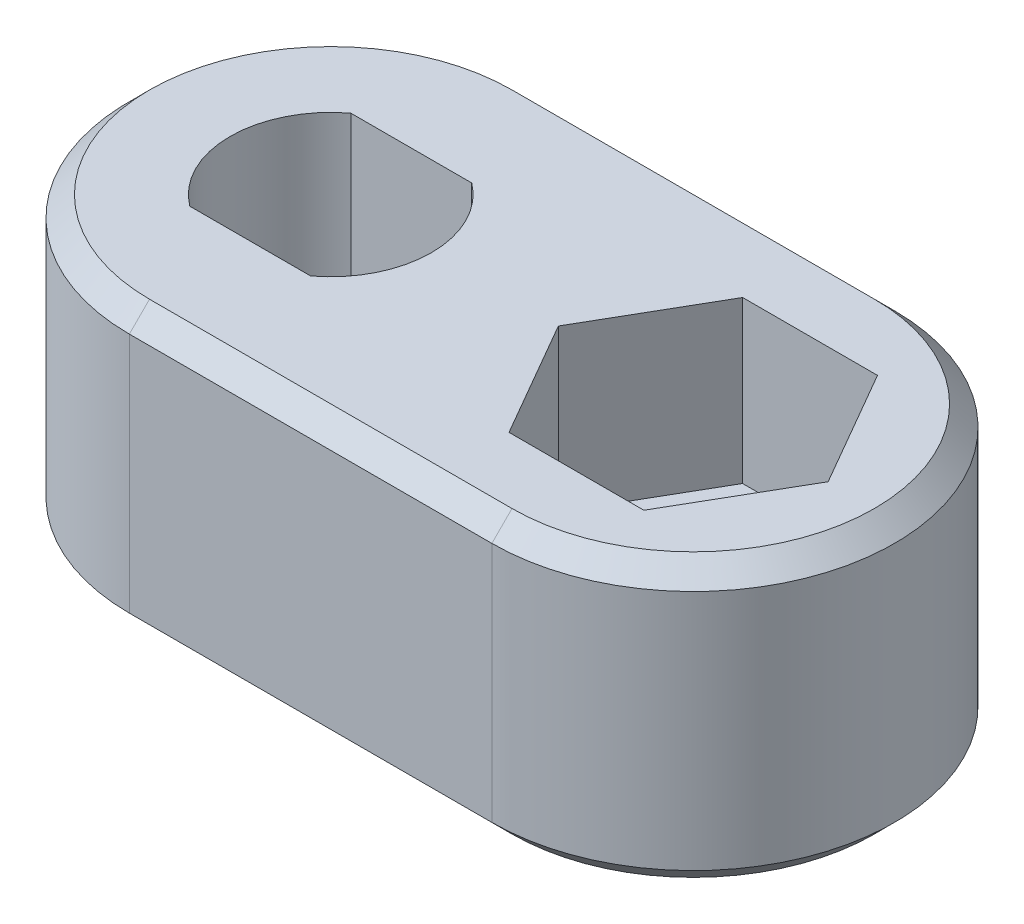
ISO-10303-21;
HEADER;
FILE_DESCRIPTION(('STEP AP214'),'2;1');
FILE_NAME('part.step','',(''),(''),'','','');
FILE_SCHEMA(('AUTOMOTIVE_DESIGN { 1 0 10303 214 1 1 1 1 }'));
ENDSEC;
DATA;
#1=APPLICATION_CONTEXT('core data for automotive mechanical design processes');
#2=APPLICATION_PROTOCOL_DEFINITION('international standard','automotive_design',2000,#1);
#3=PRODUCT_CONTEXT('',#1,'mechanical');
#4=PRODUCT('Part','Part','',(#3));
#5=PRODUCT_RELATED_PRODUCT_CATEGORY('part','',(#4));
#6=PRODUCT_DEFINITION_FORMATION('','',#4);
#7=PRODUCT_DEFINITION_CONTEXT('part definition',#1,'design');
#8=PRODUCT_DEFINITION('design','',#6,#7);
#9=PRODUCT_DEFINITION_SHAPE('','',#8);
#10=(LENGTH_UNIT() NAMED_UNIT(*) SI_UNIT(.MILLI.,.METRE.));
#11=(NAMED_UNIT(*) PLANE_ANGLE_UNIT() SI_UNIT($,.RADIAN.));
#12=(NAMED_UNIT(*) SI_UNIT($,.STERADIAN.) SOLID_ANGLE_UNIT());
#13=UNCERTAINTY_MEASURE_WITH_UNIT(LENGTH_MEASURE(1.E-05),#10,'distance_accuracy_value','');
#14=(GEOMETRIC_REPRESENTATION_CONTEXT(3) GLOBAL_UNCERTAINTY_ASSIGNED_CONTEXT((#13)) GLOBAL_UNIT_ASSIGNED_CONTEXT((#10,
#11,#12)) REPRESENTATION_CONTEXT('',''));
#15=CARTESIAN_POINT('',(0.,0.,0.));
#16=DIRECTION('',(0.,0.,1.));
#17=DIRECTION('',(1.,0.,0.));
#18=AXIS2_PLACEMENT_3D('',#15,#16,#17);
#19=CARTESIAN_POINT('',(9.,0.,0.));
#20=DIRECTION('',(0.,-1.,0.));
#21=DIRECTION('',(0.,0.,-1.));
#22=AXIS2_PLACEMENT_3D('',#19,#20,#21);
#23=CYLINDRICAL_SURFACE('',#22,2.07500000000001);
#24=CARTESIAN_POINT('',(9.,0.,0.));
#25=DIRECTION('',(0.,-1.,0.));
#26=DIRECTION('',(0.,0.,-1.));
#27=AXIS2_PLACEMENT_3D('',#24,#25,#26);
#28=CIRCLE('',#27,2.07500000000001);
#29=CARTESIAN_POINT('',(9.,0.,-2.07500000000001));
#30=VERTEX_POINT('',#29);
#31=EDGE_CURVE('E253',#30,#30,#28,.T.);
#32=ORIENTED_EDGE('',*,*,#31,.T.);
#33=EDGE_LOOP('',(#32));
#34=FACE_BOUND('',#33,.T.);
#35=CARTESIAN_POINT('',(9.,3.,0.));
#36=DIRECTION('',(0.,1.,0.));
#37=DIRECTION('',(0.,0.,1.));
#38=AXIS2_PLACEMENT_3D('',#35,#36,#37);
#39=CIRCLE('',#38,2.07500000000001);
#40=CARTESIAN_POINT('',(9.,3.,2.07500000000001));
#41=VERTEX_POINT('',#40);
#42=EDGE_CURVE('E241',#41,#41,#39,.F.);
#43=ORIENTED_EDGE('',*,*,#42,.F.);
#44=EDGE_LOOP('',(#43));
#45=FACE_BOUND('',#44,.T.);
#46=ADVANCED_FACE('F45',(#34,#45),#23,.F.);
#47=CARTESIAN_POINT('',(0.,7.,0.));
#48=DIRECTION('',(0.,-1.,0.));
#49=DIRECTION('',(0.,0.,-1.));
#50=AXIS2_PLACEMENT_3D('',#47,#48,#49);
#51=CYLINDRICAL_SURFACE('',#50,5.);
#52=DIRECTION('',(0.,-1.,0.));
#53=VECTOR('',#52,1.);
#54=CARTESIAN_POINT('',(0.,7.,5.));
#55=LINE('',#54,#53);
#56=CARTESIAN_POINT('',(0.,6.5,5.));
#57=VERTEX_POINT('',#56);
#58=CARTESIAN_POINT('',(0.,0.500000000000004,5.));
#59=VERTEX_POINT('',#58);
#60=EDGE_CURVE('E315',#57,#59,#55,.T.);
#61=ORIENTED_EDGE('',*,*,#60,.F.);
#62=CARTESIAN_POINT('',(0.,6.5,0.));
#63=DIRECTION('',(0.,1.,0.));
#64=DIRECTION('',(0.,0.,1.));
#65=AXIS2_PLACEMENT_3D('',#62,#63,#64);
#66=CIRCLE('',#65,5.);
#67=CARTESIAN_POINT('',(0.,6.5,-5.));
#68=VERTEX_POINT('',#67);
#69=EDGE_CURVE('E349',#57,#68,#66,.F.);
#70=ORIENTED_EDGE('',*,*,#69,.T.);
#71=DIRECTION('',(0.,-1.,0.));
#72=VECTOR('',#71,1.);
#73=CARTESIAN_POINT('',(0.,7.,-5.));
#74=LINE('',#73,#72);
#75=CARTESIAN_POINT('',(0.,0.500000000000004,-5.));
#76=VERTEX_POINT('',#75);
#77=EDGE_CURVE('E294',#68,#76,#74,.T.);
#78=ORIENTED_EDGE('',*,*,#77,.T.);
#79=CARTESIAN_POINT('',(0.,0.500000000000004,0.));
#80=DIRECTION('',(0.,1.,0.));
#81=DIRECTION('',(0.,0.,1.));
#82=AXIS2_PLACEMENT_3D('',#79,#80,#81);
#83=CIRCLE('',#82,5.);
#84=EDGE_CURVE('E346',#76,#59,#83,.T.);
#85=ORIENTED_EDGE('',*,*,#84,.T.);
#86=EDGE_LOOP('',(#61,#70,#78,#85));
#87=FACE_BOUND('',#86,.T.);
#88=ADVANCED_FACE('F418',(#87),#51,.T.);
#89=CARTESIAN_POINT('',(0.,7.,5.));
#90=DIRECTION('',(0.,0.,-1.));
#91=DIRECTION('',(-1.,0.,0.));
#92=AXIS2_PLACEMENT_3D('',#89,#90,#91);
#93=PLANE('',#92);
#94=DIRECTION('',(0.,-1.,0.));
#95=VECTOR('',#94,1.);
#96=CARTESIAN_POINT('',(9.,7.,5.));
#97=LINE('',#96,#95);
#98=CARTESIAN_POINT('',(9.,6.5,5.));
#99=VERTEX_POINT('',#98);
#100=CARTESIAN_POINT('',(9.,0.500000000000004,5.));
#101=VERTEX_POINT('',#100);
#102=EDGE_CURVE('E311',#99,#101,#97,.T.);
#103=ORIENTED_EDGE('',*,*,#102,.F.);
#104=DIRECTION('',(-1.,0.,0.));
#105=VECTOR('',#104,1.);
#106=CARTESIAN_POINT('',(0.,6.5,5.));
#107=LINE('',#106,#105);
#108=EDGE_CURVE('E361',#99,#57,#107,.T.);
#109=ORIENTED_EDGE('',*,*,#108,.T.);
#110=ORIENTED_EDGE('',*,*,#60,.T.);
#111=DIRECTION('',(1.,0.,0.));
#112=VECTOR('',#111,1.);
#113=CARTESIAN_POINT('',(0.,0.500000000000004,5.));
#114=LINE('',#113,#112);
#115=EDGE_CURVE('E358',#59,#101,#114,.T.);
#116=ORIENTED_EDGE('',*,*,#115,.T.);
#117=EDGE_LOOP('',(#103,#109,#110,#116));
#118=FACE_BOUND('',#117,.T.);
#119=ADVANCED_FACE('F435',(#118),#93,.F.);
#120=CARTESIAN_POINT('',(9.,7.,0.));
#121=DIRECTION('',(0.,-1.,0.));
#122=DIRECTION('',(0.,0.,-1.));
#123=AXIS2_PLACEMENT_3D('',#120,#121,#122);
#124=CYLINDRICAL_SURFACE('',#123,5.);
#125=DIRECTION('',(0.,-1.,0.));
#126=VECTOR('',#125,1.);
#127=CARTESIAN_POINT('',(9.,7.,-5.));
#128=LINE('',#127,#126);
#129=CARTESIAN_POINT('',(9.,6.5,-5.));
#130=VERTEX_POINT('',#129);
#131=CARTESIAN_POINT('',(9.,0.500000000000004,-5.));
#132=VERTEX_POINT('',#131);
#133=EDGE_CURVE('E307',#130,#132,#128,.T.);
#134=ORIENTED_EDGE('',*,*,#133,.F.);
#135=CARTESIAN_POINT('',(9.,6.5,0.));
#136=DIRECTION('',(0.,1.,0.));
#137=DIRECTION('',(0.,0.,1.));
#138=AXIS2_PLACEMENT_3D('',#135,#136,#137);
#139=CIRCLE('',#138,5.);
#140=EDGE_CURVE('E355',#130,#99,#139,.F.);
#141=ORIENTED_EDGE('',*,*,#140,.T.);
#142=ORIENTED_EDGE('',*,*,#102,.T.);
#143=CARTESIAN_POINT('',(9.,0.500000000000004,0.));
#144=DIRECTION('',(0.,1.,0.));
#145=DIRECTION('',(0.,0.,1.));
#146=AXIS2_PLACEMENT_3D('',#143,#144,#145);
#147=CIRCLE('',#146,5.);
#148=EDGE_CURVE('E352',#101,#132,#147,.T.);
#149=ORIENTED_EDGE('',*,*,#148,.T.);
#150=EDGE_LOOP('',(#134,#141,#142,#149));
#151=FACE_BOUND('',#150,.T.);
#152=ADVANCED_FACE('F431',(#151),#124,.T.);
#153=CARTESIAN_POINT('',(0.,7.,-5.));
#154=DIRECTION('',(0.,0.,1.));
#155=DIRECTION('',(1.,0.,0.));
#156=AXIS2_PLACEMENT_3D('',#153,#154,#155);
#157=PLANE('',#156);
#158=ORIENTED_EDGE('',*,*,#77,.F.);
#159=DIRECTION('',(1.,0.,0.));
#160=VECTOR('',#159,1.);
#161=CARTESIAN_POINT('',(9.,6.5,-5.));
#162=LINE('',#161,#160);
#163=EDGE_CURVE('E342',#68,#130,#162,.T.);
#164=ORIENTED_EDGE('',*,*,#163,.T.);
#165=ORIENTED_EDGE('',*,*,#133,.T.);
#166=DIRECTION('',(-1.,0.,0.));
#167=VECTOR('',#166,1.);
#168=CARTESIAN_POINT('',(0.,0.500000000000004,-5.));
#169=LINE('',#168,#167);
#170=EDGE_CURVE('E338',#132,#76,#169,.T.);
#171=ORIENTED_EDGE('',*,*,#170,.T.);
#172=EDGE_LOOP('',(#158,#164,#165,#171));
#173=FACE_BOUND('',#172,.T.);
#174=ADVANCED_FACE('F415',(#173),#157,.F.);
#175=CARTESIAN_POINT('',(0.,7.,0.));
#176=DIRECTION('',(0.,1.,0.));
#177=DIRECTION('',(0.,0.,1.));
#178=AXIS2_PLACEMENT_3D('',#175,#176,#177);
#179=PLANE('',#178);
#180=CARTESIAN_POINT('',(9.,7.,0.));
#181=DIRECTION('',(0.,1.,0.));
#182=DIRECTION('',(0.,0.,1.));
#183=AXIS2_PLACEMENT_3D('',#180,#181,#182);
#184=CIRCLE('',#183,4.5);
#185=CARTESIAN_POINT('',(9.,7.,4.5));
#186=VERTEX_POINT('',#185);
#187=CARTESIAN_POINT('',(9.,7.,-4.5));
#188=VERTEX_POINT('',#187);
#189=EDGE_CURVE('E328',#186,#188,#184,.T.);
#190=ORIENTED_EDGE('',*,*,#189,.T.);
#191=DIRECTION('',(-1.,0.,0.));
#192=VECTOR('',#191,1.);
#193=CARTESIAN_POINT('',(0.,7.,-4.5));
#194=LINE('',#193,#192);
#195=CARTESIAN_POINT('',(0.,7.,-4.5));
#196=VERTEX_POINT('',#195);
#197=EDGE_CURVE('E334',#188,#196,#194,.T.);
#198=ORIENTED_EDGE('',*,*,#197,.T.);
#199=CARTESIAN_POINT('',(0.,7.,0.));
#200=DIRECTION('',(0.,1.,0.));
#201=DIRECTION('',(0.,0.,1.));
#202=AXIS2_PLACEMENT_3D('',#199,#200,#201);
#203=CIRCLE('',#202,4.5);
#204=CARTESIAN_POINT('',(0.,7.,4.5));
#205=VERTEX_POINT('',#204);
#206=EDGE_CURVE('E331',#196,#205,#203,.T.);
#207=ORIENTED_EDGE('',*,*,#206,.T.);
#208=DIRECTION('',(1.,0.,0.));
#209=VECTOR('',#208,1.);
#210=CARTESIAN_POINT('',(9.,7.,4.5));
#211=LINE('',#210,#209);
#212=EDGE_CURVE('E319',#205,#186,#211,.T.);
#213=ORIENTED_EDGE('',*,*,#212,.T.);
#214=EDGE_LOOP('',(#190,#198,#207,#213));
#215=FACE_BOUND('',#214,.T.);
#216=DIRECTION('',(0.5,0.,-0.866025403784439));
#217=VECTOR('',#216,1.);
#218=CARTESIAN_POINT('',(10.6743157806499,7.,2.89999999999963));
#219=LINE('',#218,#217);
#220=CARTESIAN_POINT('',(10.6743157806499,7.,2.89999999999963));
#221=VERTEX_POINT('',#220);
#222=CARTESIAN_POINT('',(12.3486315612998,7.,-3.65159291693118E-13));
#223=VERTEX_POINT('',#222);
#224=EDGE_CURVE('E180',#221,#223,#219,.T.);
#225=ORIENTED_EDGE('',*,*,#224,.F.);
#226=DIRECTION('',(1.,0.,0.));
#227=VECTOR('',#226,1.);
#228=CARTESIAN_POINT('',(7.32568421935006,7.,2.89999999999963));
#229=LINE('',#228,#227);
#230=CARTESIAN_POINT('',(7.32568421935006,7.,2.89999999999963));
#231=VERTEX_POINT('',#230);
#232=EDGE_CURVE('E202',#231,#221,#229,.T.);
#233=ORIENTED_EDGE('',*,*,#232,.F.);
#234=DIRECTION('',(0.5,0.,0.866025403784439));
#235=VECTOR('',#234,1.);
#236=CARTESIAN_POINT('',(5.65136843870014,7.,-3.6457803915255E-13));
#237=LINE('',#236,#235);
#238=CARTESIAN_POINT('',(5.65136843870014,7.,-3.6457803915255E-13));
#239=VERTEX_POINT('',#238);
#240=EDGE_CURVE('E207',#239,#231,#237,.T.);
#241=ORIENTED_EDGE('',*,*,#240,.F.);
#242=DIRECTION('',(-0.5,0.,0.866025403784439));
#243=VECTOR('',#242,1.);
#244=CARTESIAN_POINT('',(7.32568421935006,7.,-2.90000000000037));
#245=LINE('',#244,#243);
#246=CARTESIAN_POINT('',(7.32568421935006,7.,-2.90000000000037));
#247=VERTEX_POINT('',#246);
#248=EDGE_CURVE('E231',#247,#239,#245,.T.);
#249=ORIENTED_EDGE('',*,*,#248,.F.);
#250=DIRECTION('',(-1.,0.,0.));
#251=VECTOR('',#250,1.);
#252=CARTESIAN_POINT('',(10.6743157806499,7.,-2.90000000000037));
#253=LINE('',#252,#251);
#254=CARTESIAN_POINT('',(10.6743157806499,7.,-2.90000000000037));
#255=VERTEX_POINT('',#254);
#256=EDGE_CURVE('E227',#255,#247,#253,.T.);
#257=ORIENTED_EDGE('',*,*,#256,.F.);
#258=DIRECTION('',(-0.5,0.,-0.866025403784439));
#259=VECTOR('',#258,1.);
#260=CARTESIAN_POINT('',(12.3486315612998,7.,-3.65159291693118E-13));
#261=LINE('',#260,#259);
#262=EDGE_CURVE('E223',#223,#255,#261,.T.);
#263=ORIENTED_EDGE('',*,*,#262,.F.);
#264=EDGE_LOOP('',(#225,#233,#241,#249,#257,#263));
#265=FACE_BOUND('',#264,.T.);
#266=CARTESIAN_POINT('',(0.,7.,0.));
#267=DIRECTION('',(0.,1.,0.));
#268=DIRECTION('',(0.,0.,1.));
#269=AXIS2_PLACEMENT_3D('',#266,#267,#268);
#270=CIRCLE('',#269,2.5);
#271=CARTESIAN_POINT('',(1.5,7.,2.));
#272=VERTEX_POINT('',#271);
#273=CARTESIAN_POINT('',(1.5,7.,-2.));
#274=VERTEX_POINT('',#273);
#275=EDGE_CURVE('E280',#272,#274,#270,.T.);
#276=ORIENTED_EDGE('',*,*,#275,.F.);
#277=DIRECTION('',(1.,0.,0.));
#278=VECTOR('',#277,1.);
#279=CARTESIAN_POINT('',(0.,7.,2.));
#280=LINE('',#279,#278);
#281=CARTESIAN_POINT('',(-1.5,7.,2.));
#282=VERTEX_POINT('',#281);
#283=EDGE_CURVE('E271',#282,#272,#280,.T.);
#284=ORIENTED_EDGE('',*,*,#283,.F.);
#285=CARTESIAN_POINT('',(-1.5,7.,-2.));
#286=VERTEX_POINT('',#285);
#287=EDGE_CURVE('E284',#286,#282,#270,.T.);
#288=ORIENTED_EDGE('',*,*,#287,.F.);
#289=DIRECTION('',(1.,0.,0.));
#290=VECTOR('',#289,1.);
#291=CARTESIAN_POINT('',(0.,7.,-2.));
#292=LINE('',#291,#290);
#293=EDGE_CURVE('E283',#286,#274,#292,.T.);
#294=ORIENTED_EDGE('',*,*,#293,.T.);
#295=EDGE_LOOP('',(#276,#284,#288,#294));
#296=FACE_BOUND('',#295,.T.);
#297=ADVANCED_FACE('F444',(#215,#265,#296),#179,.T.);
#298=CARTESIAN_POINT('',(0.,0.,0.));
#299=DIRECTION('',(0.,1.,0.));
#300=DIRECTION('',(0.,0.,1.));
#301=AXIS2_PLACEMENT_3D('',#298,#299,#300);
#302=PLANE('',#301);
#303=CARTESIAN_POINT('',(0.,0.,0.));
#304=DIRECTION('',(0.,1.,0.));
#305=DIRECTION('',(0.,0.,1.));
#306=AXIS2_PLACEMENT_3D('',#303,#304,#305);
#307=CIRCLE('',#306,4.5);
#308=CARTESIAN_POINT('',(0.,0.,4.5));
#309=VERTEX_POINT('',#308);
#310=CARTESIAN_POINT('',(0.,0.,-4.5));
#311=VERTEX_POINT('',#310);
#312=EDGE_CURVE('E55',#309,#311,#307,.F.);
#313=ORIENTED_EDGE('',*,*,#312,.T.);
#314=DIRECTION('',(1.,0.,0.));
#315=VECTOR('',#314,1.);
#316=CARTESIAN_POINT('',(0.,0.,-4.5));
#317=LINE('',#316,#315);
#318=CARTESIAN_POINT('',(9.,0.,-4.5));
#319=VERTEX_POINT('',#318);
#320=EDGE_CURVE('E11',#311,#319,#317,.T.);
#321=ORIENTED_EDGE('',*,*,#320,.T.);
#322=CARTESIAN_POINT('',(9.,0.,0.));
#323=DIRECTION('',(0.,1.,0.));
#324=DIRECTION('',(0.,0.,1.));
#325=AXIS2_PLACEMENT_3D('',#322,#323,#324);
#326=CIRCLE('',#325,4.5);
#327=CARTESIAN_POINT('',(9.,0.,4.5));
#328=VERTEX_POINT('',#327);
#329=EDGE_CURVE('E367',#319,#328,#326,.F.);
#330=ORIENTED_EDGE('',*,*,#329,.T.);
#331=DIRECTION('',(-1.,0.,0.));
#332=VECTOR('',#331,1.);
#333=CARTESIAN_POINT('',(0.,0.,4.5));
#334=LINE('',#333,#332);
#335=EDGE_CURVE('E364',#328,#309,#334,.T.);
#336=ORIENTED_EDGE('',*,*,#335,.T.);
#337=EDGE_LOOP('',(#313,#321,#330,#336));
#338=FACE_BOUND('',#337,.T.);
#339=ORIENTED_EDGE('',*,*,#31,.F.);
#340=EDGE_LOOP('',(#339));
#341=FACE_BOUND('',#340,.T.);
#342=CARTESIAN_POINT('',(0.,0.,0.));
#343=DIRECTION('',(0.,-1.,0.));
#344=DIRECTION('',(0.,0.,-1.));
#345=AXIS2_PLACEMENT_3D('',#342,#343,#344);
#346=CIRCLE('',#345,3.36);
#347=CARTESIAN_POINT('',(0.,0.,-3.36));
#348=VERTEX_POINT('',#347);
#349=EDGE_CURVE('E257',#348,#348,#346,.T.);
#350=ORIENTED_EDGE('',*,*,#349,.F.);
#351=EDGE_LOOP('',(#350));
#352=FACE_BOUND('',#351,.T.);
#353=ADVANCED_FACE('F406',(#338,#341,#352),#302,.F.);
#354=CARTESIAN_POINT('',(0.,3.,0.));
#355=DIRECTION('',(0.,1.,0.));
#356=DIRECTION('',(0.,0.,1.));
#357=AXIS2_PLACEMENT_3D('',#354,#355,#356);
#358=CYLINDRICAL_SURFACE('',#357,2.5);
#359=ORIENTED_EDGE('',*,*,#275,.T.);
#360=DIRECTION('',(0.,1.,0.));
#361=VECTOR('',#360,1.);
#362=CARTESIAN_POINT('',(1.5,3.,-2.));
#363=LINE('',#362,#361);
#364=CARTESIAN_POINT('',(1.5,3.,-2.));
#365=VERTEX_POINT('',#364);
#366=EDGE_CURVE('E279',#365,#274,#363,.T.);
#367=ORIENTED_EDGE('',*,*,#366,.F.);
#368=CARTESIAN_POINT('',(0.,3.,0.));
#369=DIRECTION('',(0.,1.,0.));
#370=DIRECTION('',(0.,0.,1.));
#371=AXIS2_PLACEMENT_3D('',#368,#369,#370);
#372=CIRCLE('',#371,2.5);
#373=CARTESIAN_POINT('',(1.5,3.,2.));
#374=VERTEX_POINT('',#373);
#375=EDGE_CURVE('E266',#374,#365,#372,.T.);
#376=ORIENTED_EDGE('',*,*,#375,.F.);
#377=DIRECTION('',(0.,1.,0.));
#378=VECTOR('',#377,1.);
#379=CARTESIAN_POINT('',(1.5,3.,2.));
#380=LINE('',#379,#378);
#381=EDGE_CURVE('E291',#374,#272,#380,.T.);
#382=ORIENTED_EDGE('',*,*,#381,.T.);
#383=EDGE_LOOP('',(#359,#367,#376,#382));
#384=FACE_BOUND('',#383,.T.);
#385=ADVANCED_FACE('F456',(#384),#358,.F.);
#386=CARTESIAN_POINT('',(0.,3.,2.));
#387=DIRECTION('',(0.,0.,1.));
#388=DIRECTION('',(1.,0.,0.));
#389=AXIS2_PLACEMENT_3D('',#386,#387,#388);
#390=PLANE('',#389);
#391=ORIENTED_EDGE('',*,*,#283,.T.);
#392=ORIENTED_EDGE('',*,*,#381,.F.);
#393=DIRECTION('',(1.,0.,0.));
#394=VECTOR('',#393,1.);
#395=CARTESIAN_POINT('',(0.,3.,2.));
#396=LINE('',#395,#394);
#397=CARTESIAN_POINT('',(-1.5,3.,2.));
#398=VERTEX_POINT('',#397);
#399=EDGE_CURVE('E275',#398,#374,#396,.T.);
#400=ORIENTED_EDGE('',*,*,#399,.F.);
#401=DIRECTION('',(0.,1.,0.));
#402=VECTOR('',#401,1.);
#403=CARTESIAN_POINT('',(-1.5,3.,2.));
#404=LINE('',#403,#402);
#405=EDGE_CURVE('E295',#398,#282,#404,.T.);
#406=ORIENTED_EDGE('',*,*,#405,.T.);
#407=EDGE_LOOP('',(#391,#392,#400,#406));
#408=FACE_BOUND('',#407,.T.);
#409=ADVANCED_FACE('F520',(#408),#390,.F.);
#410=ORIENTED_EDGE('',*,*,#287,.T.);
#411=ORIENTED_EDGE('',*,*,#405,.F.);
#412=CARTESIAN_POINT('',(-1.5,3.,-2.));
#413=VERTEX_POINT('',#412);
#414=EDGE_CURVE('E272',#413,#398,#372,.T.);
#415=ORIENTED_EDGE('',*,*,#414,.F.);
#416=DIRECTION('',(0.,1.,0.));
#417=VECTOR('',#416,1.);
#418=CARTESIAN_POINT('',(-1.5,3.,-2.));
#419=LINE('',#418,#417);
#420=EDGE_CURVE('E298',#413,#286,#419,.T.);
#421=ORIENTED_EDGE('',*,*,#420,.T.);
#422=EDGE_LOOP('',(#410,#411,#415,#421));
#423=FACE_BOUND('',#422,.T.);
#424=ADVANCED_FACE('F468',(#423),#358,.F.);
#425=CARTESIAN_POINT('',(0.,3.,-2.));
#426=DIRECTION('',(0.,0.,1.));
#427=DIRECTION('',(1.,0.,0.));
#428=AXIS2_PLACEMENT_3D('',#425,#426,#427);
#429=PLANE('',#428);
#430=ORIENTED_EDGE('',*,*,#293,.F.);
#431=ORIENTED_EDGE('',*,*,#420,.F.);
#432=DIRECTION('',(1.,0.,0.));
#433=VECTOR('',#432,1.);
#434=CARTESIAN_POINT('',(0.,3.,-2.));
#435=LINE('',#434,#433);
#436=EDGE_CURVE('E270',#413,#365,#435,.T.);
#437=ORIENTED_EDGE('',*,*,#436,.T.);
#438=ORIENTED_EDGE('',*,*,#366,.T.);
#439=EDGE_LOOP('',(#430,#431,#437,#438));
#440=FACE_BOUND('',#439,.T.);
#441=ADVANCED_FACE('F459',(#440),#429,.T.);
#442=CARTESIAN_POINT('',(0.,3.,0.));
#443=DIRECTION('',(0.,1.,0.));
#444=DIRECTION('',(0.,0.,1.));
#445=AXIS2_PLACEMENT_3D('',#442,#443,#444);
#446=PLANE('',#445);
#447=CARTESIAN_POINT('',(0.,3.,0.));
#448=DIRECTION('',(0.,1.,0.));
#449=DIRECTION('',(0.,0.,1.));
#450=AXIS2_PLACEMENT_3D('',#447,#448,#449);
#451=CIRCLE('',#450,1.7);
#452=CARTESIAN_POINT('',(0.,3.,1.7));
#453=VERTEX_POINT('',#452);
#454=EDGE_CURVE('E265',#453,#453,#451,.T.);
#455=ORIENTED_EDGE('',*,*,#454,.F.);
#456=EDGE_LOOP('',(#455));
#457=FACE_BOUND('',#456,.T.);
#458=ORIENTED_EDGE('',*,*,#375,.T.);
#459=ORIENTED_EDGE('',*,*,#436,.F.);
#460=ORIENTED_EDGE('',*,*,#414,.T.);
#461=ORIENTED_EDGE('',*,*,#399,.T.);
#462=EDGE_LOOP('',(#458,#459,#460,#461));
#463=FACE_BOUND('',#462,.T.);
#464=ADVANCED_FACE('F464',(#457,#463),#446,.T.);
#465=CARTESIAN_POINT('',(0.,0.,0.));
#466=DIRECTION('',(0.,-1.,0.));
#467=DIRECTION('',(0.,0.,-1.));
#468=AXIS2_PLACEMENT_3D('',#465,#466,#467);
#469=CYLINDRICAL_SURFACE('',#468,1.7);
#470=ORIENTED_EDGE('',*,*,#454,.T.);
#471=EDGE_LOOP('',(#470));
#472=FACE_BOUND('',#471,.T.);
#473=CARTESIAN_POINT('',(0.,1.66,0.));
#474=DIRECTION('',(0.,-1.,0.));
#475=DIRECTION('',(0.,0.,-1.));
#476=AXIS2_PLACEMENT_3D('',#473,#474,#475);
#477=CIRCLE('',#476,1.7);
#478=CARTESIAN_POINT('',(0.,1.66,-1.7));
#479=VERTEX_POINT('',#478);
#480=EDGE_CURVE('E261',#479,#479,#477,.T.);
#481=ORIENTED_EDGE('',*,*,#480,.T.);
#482=EDGE_LOOP('',(#481));
#483=FACE_BOUND('',#482,.T.);
#484=ADVANCED_FACE('F543',(#472,#483),#469,.F.);
#485=CARTESIAN_POINT('',(0.,0.,0.));
#486=DIRECTION('',(0.,-1.,0.));
#487=DIRECTION('',(0.,0.,-1.));
#488=AXIS2_PLACEMENT_3D('',#485,#486,#487);
#489=CONICAL_SURFACE('',#488,3.36,0.785398163397448);
#490=ORIENTED_EDGE('',*,*,#480,.F.);
#491=EDGE_LOOP('',(#490));
#492=FACE_BOUND('',#491,.T.);
#493=ORIENTED_EDGE('',*,*,#349,.T.);
#494=EDGE_LOOP('',(#493));
#495=FACE_BOUND('',#494,.T.);
#496=ADVANCED_FACE('F540',(#492,#495),#489,.F.);
#497=CARTESIAN_POINT('',(0.,3.,0.));
#498=DIRECTION('',(0.,1.,0.));
#499=DIRECTION('',(0.,0.,1.));
#500=AXIS2_PLACEMENT_3D('',#497,#498,#499);
#501=PLANE('',#500);
#502=DIRECTION('',(0.5,0.,-0.866025403784439));
#503=VECTOR('',#502,1.);
#504=CARTESIAN_POINT('',(10.6743157806499,3.,2.89999999999963));
#505=LINE('',#504,#503);
#506=CARTESIAN_POINT('',(10.6743157806499,3.,2.89999999999963));
#507=VERTEX_POINT('',#506);
#508=CARTESIAN_POINT('',(12.3486315612998,3.,-3.65159291693118E-13));
#509=VERTEX_POINT('',#508);
#510=EDGE_CURVE('E177',#507,#509,#505,.T.);
#511=ORIENTED_EDGE('',*,*,#510,.T.);
#512=DIRECTION('',(-0.5,0.,-0.866025403784439));
#513=VECTOR('',#512,1.);
#514=CARTESIAN_POINT('',(12.3486315612998,3.,-3.65159291693118E-13));
#515=LINE('',#514,#513);
#516=CARTESIAN_POINT('',(10.6743157806499,3.,-2.90000000000037));
#517=VERTEX_POINT('',#516);
#518=EDGE_CURVE('E189',#509,#517,#515,.T.);
#519=ORIENTED_EDGE('',*,*,#518,.T.);
#520=DIRECTION('',(-1.,0.,0.));
#521=VECTOR('',#520,1.);
#522=CARTESIAN_POINT('',(10.6743157806499,3.,-2.90000000000037));
#523=LINE('',#522,#521);
#524=CARTESIAN_POINT('',(7.32568421935006,3.,-2.90000000000037));
#525=VERTEX_POINT('',#524);
#526=EDGE_CURVE('E195',#517,#525,#523,.T.);
#527=ORIENTED_EDGE('',*,*,#526,.T.);
#528=DIRECTION('',(-0.5,0.,0.866025403784439));
#529=VECTOR('',#528,1.);
#530=CARTESIAN_POINT('',(7.32568421935006,3.,-2.90000000000037));
#531=LINE('',#530,#529);
#532=CARTESIAN_POINT('',(5.65136843870014,3.,-3.6457803915255E-13));
#533=VERTEX_POINT('',#532);
#534=EDGE_CURVE('E212',#525,#533,#531,.T.);
#535=ORIENTED_EDGE('',*,*,#534,.T.);
#536=DIRECTION('',(0.5,0.,0.866025403784439));
#537=VECTOR('',#536,1.);
#538=CARTESIAN_POINT('',(5.65136843870014,3.,-3.6457803915255E-13));
#539=LINE('',#538,#537);
#540=CARTESIAN_POINT('',(7.32568421935006,3.,2.89999999999963));
#541=VERTEX_POINT('',#540);
#542=EDGE_CURVE('E216',#533,#541,#539,.T.);
#543=ORIENTED_EDGE('',*,*,#542,.T.);
#544=DIRECTION('',(1.,0.,0.));
#545=VECTOR('',#544,1.);
#546=CARTESIAN_POINT('',(7.32568421935006,3.,2.89999999999963));
#547=LINE('',#546,#545);
#548=EDGE_CURVE('E186',#541,#507,#547,.T.);
#549=ORIENTED_EDGE('',*,*,#548,.T.);
#550=EDGE_LOOP('',(#511,#519,#527,#535,#543,#549));
#551=FACE_BOUND('',#550,.T.);
#552=ORIENTED_EDGE('',*,*,#42,.T.);
#553=EDGE_LOOP('',(#552));
#554=FACE_BOUND('',#553,.T.);
#555=ADVANCED_FACE('F197',(#551,#554),#501,.T.);
#556=CARTESIAN_POINT('',(10.6743157806499,3.,2.89999999999963));
#557=DIRECTION('',(0.866025403784439,0.,0.5));
#558=DIRECTION('',(0.5,0.,-0.866025403784439));
#559=AXIS2_PLACEMENT_3D('',#556,#557,#558);
#560=PLANE('',#559);
#561=ORIENTED_EDGE('',*,*,#224,.T.);
#562=DIRECTION('',(0.,1.,0.));
#563=VECTOR('',#562,1.);
#564=CARTESIAN_POINT('',(12.3486315612998,3.,-3.65159291693118E-13));
#565=LINE('',#564,#563);
#566=EDGE_CURVE('E173',#509,#223,#565,.T.);
#567=ORIENTED_EDGE('',*,*,#566,.F.);
#568=ORIENTED_EDGE('',*,*,#510,.F.);
#569=DIRECTION('',(0.,1.,0.));
#570=VECTOR('',#569,1.);
#571=CARTESIAN_POINT('',(10.6743157806499,3.,2.89999999999963));
#572=LINE('',#571,#570);
#573=EDGE_CURVE('E238',#507,#221,#572,.T.);
#574=ORIENTED_EDGE('',*,*,#573,.T.);
#575=EDGE_LOOP('',(#561,#567,#568,#574));
#576=FACE_BOUND('',#575,.T.);
#577=ADVANCED_FACE('F175',(#576),#560,.F.);
#578=CARTESIAN_POINT('',(7.32568421935006,3.,2.89999999999963));
#579=DIRECTION('',(0.,0.,1.));
#580=DIRECTION('',(1.,0.,0.));
#581=AXIS2_PLACEMENT_3D('',#578,#579,#580);
#582=PLANE('',#581);
#583=ORIENTED_EDGE('',*,*,#232,.T.);
#584=ORIENTED_EDGE('',*,*,#573,.F.);
#585=ORIENTED_EDGE('',*,*,#548,.F.);
#586=DIRECTION('',(0.,1.,0.));
#587=VECTOR('',#586,1.);
#588=CARTESIAN_POINT('',(7.32568421935006,3.,2.89999999999963));
#589=LINE('',#588,#587);
#590=EDGE_CURVE('E242',#541,#231,#589,.T.);
#591=ORIENTED_EDGE('',*,*,#590,.T.);
#592=EDGE_LOOP('',(#583,#584,#585,#591));
#593=FACE_BOUND('',#592,.T.);
#594=ADVANCED_FACE('F632',(#593),#582,.F.);
#595=CARTESIAN_POINT('',(5.65136843870014,3.,-3.6457803915255E-13));
#596=DIRECTION('',(-0.866025403784439,0.,0.5));
#597=DIRECTION('',(0.5,0.,0.866025403784439));
#598=AXIS2_PLACEMENT_3D('',#595,#596,#597);
#599=PLANE('',#598);
#600=ORIENTED_EDGE('',*,*,#240,.T.);
#601=ORIENTED_EDGE('',*,*,#590,.F.);
#602=ORIENTED_EDGE('',*,*,#542,.F.);
#603=DIRECTION('',(0.,1.,0.));
#604=VECTOR('',#603,1.);
#605=CARTESIAN_POINT('',(5.65136843870014,3.,-3.6457803915255E-13));
#606=LINE('',#605,#604);
#607=EDGE_CURVE('E245',#533,#239,#606,.T.);
#608=ORIENTED_EDGE('',*,*,#607,.T.);
#609=EDGE_LOOP('',(#600,#601,#602,#608));
#610=FACE_BOUND('',#609,.T.);
#611=ADVANCED_FACE('F624',(#610),#599,.F.);
#612=CARTESIAN_POINT('',(7.32568421935006,3.,-2.90000000000037));
#613=DIRECTION('',(-0.866025403784439,0.,-0.5));
#614=DIRECTION('',(-0.5,0.,0.866025403784439));
#615=AXIS2_PLACEMENT_3D('',#612,#613,#614);
#616=PLANE('',#615);
#617=ORIENTED_EDGE('',*,*,#248,.T.);
#618=ORIENTED_EDGE('',*,*,#607,.F.);
#619=ORIENTED_EDGE('',*,*,#534,.F.);
#620=DIRECTION('',(0.,1.,0.));
#621=VECTOR('',#620,1.);
#622=CARTESIAN_POINT('',(7.32568421935006,3.,-2.90000000000037));
#623=LINE('',#622,#621);
#624=EDGE_CURVE('E248',#525,#247,#623,.T.);
#625=ORIENTED_EDGE('',*,*,#624,.T.);
#626=EDGE_LOOP('',(#617,#618,#619,#625));
#627=FACE_BOUND('',#626,.T.);
#628=ADVANCED_FACE('F616',(#627),#616,.F.);
#629=CARTESIAN_POINT('',(10.6743157806499,3.,-2.90000000000037));
#630=DIRECTION('',(0.,0.,-1.));
#631=DIRECTION('',(-1.,0.,0.));
#632=AXIS2_PLACEMENT_3D('',#629,#630,#631);
#633=PLANE('',#632);
#634=ORIENTED_EDGE('',*,*,#256,.T.);
#635=ORIENTED_EDGE('',*,*,#624,.F.);
#636=ORIENTED_EDGE('',*,*,#526,.F.);
#637=DIRECTION('',(0.,1.,0.));
#638=VECTOR('',#637,1.);
#639=CARTESIAN_POINT('',(10.6743157806499,3.,-2.90000000000037));
#640=LINE('',#639,#638);
#641=EDGE_CURVE('E185',#517,#255,#640,.T.);
#642=ORIENTED_EDGE('',*,*,#641,.T.);
#643=EDGE_LOOP('',(#634,#635,#636,#642));
#644=FACE_BOUND('',#643,.T.);
#645=ADVANCED_FACE('F609',(#644),#633,.F.);
#646=CARTESIAN_POINT('',(12.3486315612998,3.,-3.65159291693118E-13));
#647=DIRECTION('',(0.866025403784439,0.,-0.5));
#648=DIRECTION('',(-0.5,0.,-0.866025403784439));
#649=AXIS2_PLACEMENT_3D('',#646,#647,#648);
#650=PLANE('',#649);
#651=ORIENTED_EDGE('',*,*,#262,.T.);
#652=ORIENTED_EDGE('',*,*,#641,.F.);
#653=ORIENTED_EDGE('',*,*,#518,.F.);
#654=ORIENTED_EDGE('',*,*,#566,.T.);
#655=EDGE_LOOP('',(#651,#652,#653,#654));
#656=FACE_BOUND('',#655,.T.);
#657=ADVANCED_FACE('F190',(#656),#650,.F.);
#658=CARTESIAN_POINT('',(0.,7.,4.5));
#659=DIRECTION('',(0.,0.707106781186547,0.707106781186547));
#660=DIRECTION('',(-1.,0.,0.));
#661=AXIS2_PLACEMENT_3D('',#658,#659,#660);
#662=PLANE('',#661);
#663=DIRECTION('',(0.,0.707106781186547,-0.707106781186547));
#664=VECTOR('',#663,1.);
#665=CARTESIAN_POINT('',(0.,6.5,5.));
#666=LINE('',#665,#664);
#667=EDGE_CURVE('E378',#57,#205,#666,.T.);
#668=ORIENTED_EDGE('',*,*,#667,.F.);
#669=ORIENTED_EDGE('',*,*,#108,.F.);
#670=DIRECTION('',(0.,-0.707106781186547,0.707106781186547));
#671=VECTOR('',#670,1.);
#672=CARTESIAN_POINT('',(9.,7.,4.5));
#673=LINE('',#672,#671);
#674=EDGE_CURVE('E224',#186,#99,#673,.T.);
#675=ORIENTED_EDGE('',*,*,#674,.F.);
#676=ORIENTED_EDGE('',*,*,#212,.F.);
#677=EDGE_LOOP('',(#668,#669,#675,#676));
#678=FACE_BOUND('',#677,.T.);
#679=ADVANCED_FACE('F438',(#678),#662,.T.);
#680=CARTESIAN_POINT('',(9.,7.,0.));
#681=DIRECTION('',(0.,-1.,0.));
#682=DIRECTION('',(0.,0.,-1.));
#683=AXIS2_PLACEMENT_3D('',#680,#681,#682);
#684=CONICAL_SURFACE('',#683,4.5,0.785398163397448);
#685=ORIENTED_EDGE('',*,*,#674,.T.);
#686=ORIENTED_EDGE('',*,*,#140,.F.);
#687=DIRECTION('',(0.,-0.707106781186547,-0.707106781186547));
#688=VECTOR('',#687,1.);
#689=CARTESIAN_POINT('',(9.,7.,-4.5));
#690=LINE('',#689,#688);
#691=EDGE_CURVE('E375',#188,#130,#690,.T.);
#692=ORIENTED_EDGE('',*,*,#691,.F.);
#693=ORIENTED_EDGE('',*,*,#189,.F.);
#694=EDGE_LOOP('',(#685,#686,#692,#693));
#695=FACE_BOUND('',#694,.T.);
#696=ADVANCED_FACE('F442',(#695),#684,.T.);
#697=CARTESIAN_POINT('',(0.,7.,0.));
#698=DIRECTION('',(0.,-1.,0.));
#699=DIRECTION('',(0.,0.,-1.));
#700=AXIS2_PLACEMENT_3D('',#697,#698,#699);
#701=CONICAL_SURFACE('',#700,4.5,0.785398163397448);
#702=ORIENTED_EDGE('',*,*,#667,.T.);
#703=ORIENTED_EDGE('',*,*,#206,.F.);
#704=DIRECTION('',(0.,0.707106781186547,0.707106781186547));
#705=VECTOR('',#704,1.);
#706=CARTESIAN_POINT('',(0.,6.5,-5.));
#707=LINE('',#706,#705);
#708=EDGE_CURVE('E372',#68,#196,#707,.T.);
#709=ORIENTED_EDGE('',*,*,#708,.F.);
#710=ORIENTED_EDGE('',*,*,#69,.F.);
#711=EDGE_LOOP('',(#702,#703,#709,#710));
#712=FACE_BOUND('',#711,.T.);
#713=ADVANCED_FACE('F423',(#712),#701,.T.);
#714=CARTESIAN_POINT('',(0.,7.,-4.5));
#715=DIRECTION('',(0.,0.707106781186547,-0.707106781186547));
#716=DIRECTION('',(1.,0.,0.));
#717=AXIS2_PLACEMENT_3D('',#714,#715,#716);
#718=PLANE('',#717);
#719=ORIENTED_EDGE('',*,*,#691,.T.);
#720=ORIENTED_EDGE('',*,*,#163,.F.);
#721=ORIENTED_EDGE('',*,*,#708,.T.);
#722=ORIENTED_EDGE('',*,*,#197,.F.);
#723=EDGE_LOOP('',(#719,#720,#721,#722));
#724=FACE_BOUND('',#723,.T.);
#725=ADVANCED_FACE('F427',(#724),#718,.T.);
#726=CARTESIAN_POINT('',(0.,0.500000000000004,5.));
#727=DIRECTION('',(0.,0.707106781186547,-0.707106781186547));
#728=DIRECTION('',(1.,0.,0.));
#729=AXIS2_PLACEMENT_3D('',#726,#727,#728);
#730=PLANE('',#729);
#731=DIRECTION('',(0.,0.707106781186547,0.707106781186547));
#732=VECTOR('',#731,1.);
#733=CARTESIAN_POINT('',(0.,0.,4.5));
#734=LINE('',#733,#732);
#735=EDGE_CURVE('E389',#309,#59,#734,.T.);
#736=ORIENTED_EDGE('',*,*,#735,.F.);
#737=ORIENTED_EDGE('',*,*,#335,.F.);
#738=DIRECTION('',(0.,-0.707106781186547,-0.707106781186547));
#739=VECTOR('',#738,1.);
#740=CARTESIAN_POINT('',(9.,0.500000000000004,5.));
#741=LINE('',#740,#739);
#742=EDGE_CURVE('E49',#101,#328,#741,.T.);
#743=ORIENTED_EDGE('',*,*,#742,.F.);
#744=ORIENTED_EDGE('',*,*,#115,.F.);
#745=EDGE_LOOP('',(#736,#737,#743,#744));
#746=FACE_BOUND('',#745,.T.);
#747=ADVANCED_FACE('F47',(#746),#730,.F.);
#748=CARTESIAN_POINT('',(9.,0.500000000000004,0.));
#749=DIRECTION('',(0.,1.,0.));
#750=DIRECTION('',(0.,0.,1.));
#751=AXIS2_PLACEMENT_3D('',#748,#749,#750);
#752=CONICAL_SURFACE('',#751,5.,0.785398163397448);
#753=ORIENTED_EDGE('',*,*,#742,.T.);
#754=ORIENTED_EDGE('',*,*,#329,.F.);
#755=DIRECTION('',(0.,-0.707106781186547,0.707106781186547));
#756=VECTOR('',#755,1.);
#757=CARTESIAN_POINT('',(9.,0.500000000000004,-5.));
#758=LINE('',#757,#756);
#759=EDGE_CURVE('E68',#132,#319,#758,.T.);
#760=ORIENTED_EDGE('',*,*,#759,.F.);
#761=ORIENTED_EDGE('',*,*,#148,.F.);
#762=EDGE_LOOP('',(#753,#754,#760,#761));
#763=FACE_BOUND('',#762,.T.);
#764=ADVANCED_FACE('F402',(#763),#752,.T.);
#765=CARTESIAN_POINT('',(0.,0.500000000000004,0.));
#766=DIRECTION('',(0.,1.,0.));
#767=DIRECTION('',(0.,0.,1.));
#768=AXIS2_PLACEMENT_3D('',#765,#766,#767);
#769=CONICAL_SURFACE('',#768,5.,0.785398163397448);
#770=ORIENTED_EDGE('',*,*,#735,.T.);
#771=ORIENTED_EDGE('',*,*,#84,.F.);
#772=DIRECTION('',(0.,0.707106781186547,-0.707106781186547));
#773=VECTOR('',#772,1.);
#774=CARTESIAN_POINT('',(0.,0.,-4.5));
#775=LINE('',#774,#773);
#776=EDGE_CURVE('E385',#311,#76,#775,.T.);
#777=ORIENTED_EDGE('',*,*,#776,.F.);
#778=ORIENTED_EDGE('',*,*,#312,.F.);
#779=EDGE_LOOP('',(#770,#771,#777,#778));
#780=FACE_BOUND('',#779,.T.);
#781=ADVANCED_FACE('F410',(#780),#769,.T.);
#782=CARTESIAN_POINT('',(0.,0.500000000000004,-5.));
#783=DIRECTION('',(0.,0.707106781186547,0.707106781186547));
#784=DIRECTION('',(-1.,0.,0.));
#785=AXIS2_PLACEMENT_3D('',#782,#783,#784);
#786=PLANE('',#785);
#787=ORIENTED_EDGE('',*,*,#759,.T.);
#788=ORIENTED_EDGE('',*,*,#320,.F.);
#789=ORIENTED_EDGE('',*,*,#776,.T.);
#790=ORIENTED_EDGE('',*,*,#170,.F.);
#791=EDGE_LOOP('',(#787,#788,#789,#790));
#792=FACE_BOUND('',#791,.T.);
#793=ADVANCED_FACE('F409',(#792),#786,.F.);
#794=CLOSED_SHELL('',(#46,#88,#119,#152,#174,#297,#353,#385,#409,#424,#441,#464,#484,#496,#555,
#577,#594,#611,#628,#645,#657,#679,#696,#713,#725,#747,#764,#781,#793));
#795=MANIFOLD_SOLID_BREP('B2',#794);
#796=ADVANCED_BREP_SHAPE_REPRESENTATION('',(#18,#795),#14);
#797=SHAPE_DEFINITION_REPRESENTATION(#9,#796);
ENDSEC;
END-ISO-10303-21;
